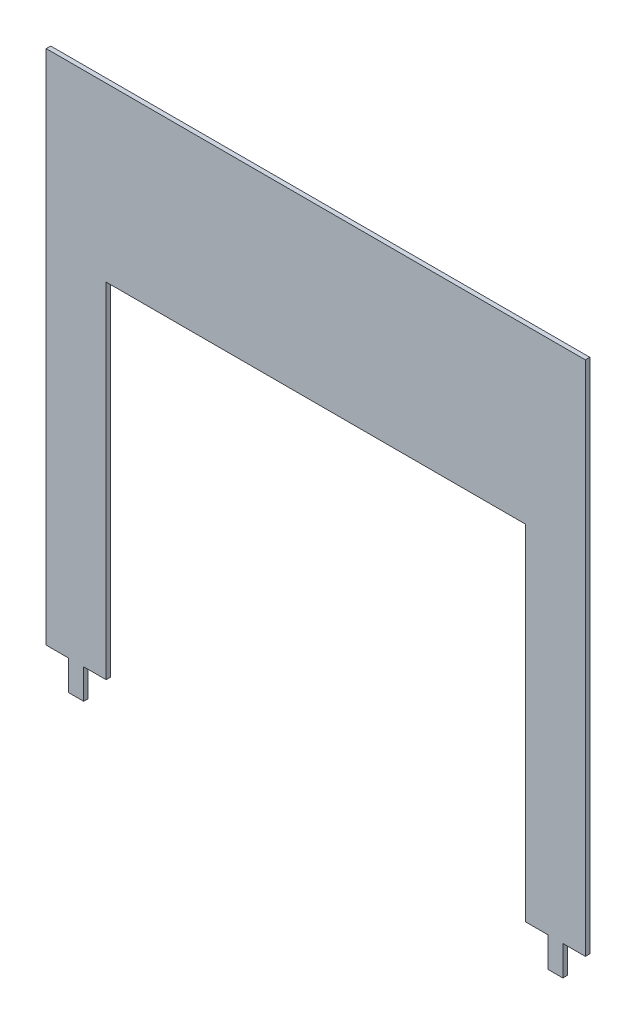
ISO-10303-21;
HEADER;
FILE_DESCRIPTION(('STEP AP214'),'2;1');
FILE_NAME('part.step','',(''),(''),'','','');
FILE_SCHEMA(('AUTOMOTIVE_DESIGN { 1 0 10303 214 1 1 1 1 }'));
ENDSEC;
DATA;
#1=APPLICATION_CONTEXT('core data for automotive mechanical design processes');
#2=APPLICATION_PROTOCOL_DEFINITION('international standard','automotive_design',2000,#1);
#3=PRODUCT_CONTEXT('',#1,'mechanical');
#4=PRODUCT('Part','Part','',(#3));
#5=PRODUCT_RELATED_PRODUCT_CATEGORY('part','',(#4));
#6=PRODUCT_DEFINITION_FORMATION('','',#4);
#7=PRODUCT_DEFINITION_CONTEXT('part definition',#1,'design');
#8=PRODUCT_DEFINITION('design','',#6,#7);
#9=PRODUCT_DEFINITION_SHAPE('','',#8);
#10=(LENGTH_UNIT() NAMED_UNIT(*) SI_UNIT(.MILLI.,.METRE.));
#11=(NAMED_UNIT(*) PLANE_ANGLE_UNIT() SI_UNIT($,.RADIAN.));
#12=(NAMED_UNIT(*) SI_UNIT($,.STERADIAN.) SOLID_ANGLE_UNIT());
#13=UNCERTAINTY_MEASURE_WITH_UNIT(LENGTH_MEASURE(1.E-05),#10,'distance_accuracy_value','');
#14=(GEOMETRIC_REPRESENTATION_CONTEXT(3) GLOBAL_UNCERTAINTY_ASSIGNED_CONTEXT((#13)) GLOBAL_UNIT_ASSIGNED_CONTEXT((#10,
#11,#12)) REPRESENTATION_CONTEXT('',''));
#15=CARTESIAN_POINT('',(0.,0.,0.));
#16=DIRECTION('',(0.,0.,1.));
#17=DIRECTION('',(1.,0.,0.));
#18=AXIS2_PLACEMENT_3D('',#15,#16,#17);
#19=CARTESIAN_POINT('',(0.,0.,0.3));
#20=DIRECTION('',(0.,0.,1.));
#21=DIRECTION('',(1.,0.,0.));
#22=AXIS2_PLACEMENT_3D('',#19,#20,#21);
#23=PLANE('',#22);
#24=DIRECTION('',(1.,0.,0.));
#25=VECTOR('',#24,1.);
#26=CARTESIAN_POINT('',(18.,34.5,0.3));
#27=LINE('',#26,#25);
#28=CARTESIAN_POINT('',(-18.,34.5,0.3));
#29=VERTEX_POINT('',#28);
#30=CARTESIAN_POINT('',(18.,34.5,0.3));
#31=VERTEX_POINT('',#30);
#32=EDGE_CURVE('E86',#29,#31,#27,.T.);
#33=ORIENTED_EDGE('',*,*,#32,.F.);
#34=DIRECTION('',(0.,1.,0.));
#35=VECTOR('',#34,1.);
#36=CARTESIAN_POINT('',(-18.,34.5,0.3));
#37=LINE('',#36,#35);
#38=CARTESIAN_POINT('',(-18.,0.,0.3));
#39=VERTEX_POINT('',#38);
#40=EDGE_CURVE('E143',#39,#29,#37,.T.);
#41=ORIENTED_EDGE('',*,*,#40,.F.);
#42=DIRECTION('',(1.,0.,0.));
#43=VECTOR('',#42,1.);
#44=CARTESIAN_POINT('',(-18.,0.,0.3));
#45=LINE('',#44,#43);
#46=CARTESIAN_POINT('',(-16.5,0.,0.3));
#47=VERTEX_POINT('',#46);
#48=EDGE_CURVE('E134',#47,#39,#45,.F.);
#49=ORIENTED_EDGE('',*,*,#48,.F.);
#50=DIRECTION('',(0.,1.,0.));
#51=VECTOR('',#50,1.);
#52=CARTESIAN_POINT('',(-16.5,0.,0.3));
#53=LINE('',#52,#51);
#54=CARTESIAN_POINT('',(-16.5,-2.,0.3));
#55=VERTEX_POINT('',#54);
#56=EDGE_CURVE('E148',#55,#47,#53,.T.);
#57=ORIENTED_EDGE('',*,*,#56,.F.);
#58=DIRECTION('',(1.,0.,0.));
#59=VECTOR('',#58,1.);
#60=CARTESIAN_POINT('',(-16.5,-2.,0.3));
#61=LINE('',#60,#59);
#62=CARTESIAN_POINT('',(-15.5,-2.,0.3));
#63=VERTEX_POINT('',#62);
#64=EDGE_CURVE('E152',#63,#55,#61,.F.);
#65=ORIENTED_EDGE('',*,*,#64,.F.);
#66=DIRECTION('',(0.,1.,0.));
#67=VECTOR('',#66,1.);
#68=CARTESIAN_POINT('',(-15.5,-2.,0.3));
#69=LINE('',#68,#67);
#70=CARTESIAN_POINT('',(-15.5,0.,0.3));
#71=VERTEX_POINT('',#70);
#72=EDGE_CURVE('E156',#71,#63,#69,.F.);
#73=ORIENTED_EDGE('',*,*,#72,.F.);
#74=DIRECTION('',(1.,0.,0.));
#75=VECTOR('',#74,1.);
#76=CARTESIAN_POINT('',(-15.5,0.,0.3));
#77=LINE('',#76,#75);
#78=CARTESIAN_POINT('',(-14.,0.,0.3));
#79=VERTEX_POINT('',#78);
#80=EDGE_CURVE('E160',#79,#71,#77,.F.);
#81=ORIENTED_EDGE('',*,*,#80,.F.);
#82=DIRECTION('',(0.,1.,0.));
#83=VECTOR('',#82,1.);
#84=CARTESIAN_POINT('',(-14.,0.,0.3));
#85=LINE('',#84,#83);
#86=CARTESIAN_POINT('',(-14.,23.,0.3));
#87=VERTEX_POINT('',#86);
#88=EDGE_CURVE('E164',#87,#79,#85,.F.);
#89=ORIENTED_EDGE('',*,*,#88,.F.);
#90=DIRECTION('',(1.,0.,0.));
#91=VECTOR('',#90,1.);
#92=CARTESIAN_POINT('',(-14.,23.,0.3));
#93=LINE('',#92,#91);
#94=CARTESIAN_POINT('',(14.,23.,0.3));
#95=VERTEX_POINT('',#94);
#96=EDGE_CURVE('E168',#95,#87,#93,.F.);
#97=ORIENTED_EDGE('',*,*,#96,.F.);
#98=DIRECTION('',(0.,1.,0.));
#99=VECTOR('',#98,1.);
#100=CARTESIAN_POINT('',(14.,23.,0.3));
#101=LINE('',#100,#99);
#102=CARTESIAN_POINT('',(14.,0.,0.3));
#103=VERTEX_POINT('',#102);
#104=EDGE_CURVE('E172',#103,#95,#101,.T.);
#105=ORIENTED_EDGE('',*,*,#104,.F.);
#106=DIRECTION('',(1.,0.,0.));
#107=VECTOR('',#106,1.);
#108=CARTESIAN_POINT('',(14.,0.,0.3));
#109=LINE('',#108,#107);
#110=CARTESIAN_POINT('',(15.5,0.,0.3));
#111=VERTEX_POINT('',#110);
#112=EDGE_CURVE('E176',#111,#103,#109,.F.);
#113=ORIENTED_EDGE('',*,*,#112,.F.);
#114=DIRECTION('',(0.,1.,0.));
#115=VECTOR('',#114,1.);
#116=CARTESIAN_POINT('',(15.5,0.,0.3));
#117=LINE('',#116,#115);
#118=CARTESIAN_POINT('',(15.5,-2.,0.3));
#119=VERTEX_POINT('',#118);
#120=EDGE_CURVE('E180',#119,#111,#117,.T.);
#121=ORIENTED_EDGE('',*,*,#120,.F.);
#122=DIRECTION('',(1.,0.,0.));
#123=VECTOR('',#122,1.);
#124=CARTESIAN_POINT('',(15.5,-2.,0.3));
#125=LINE('',#124,#123);
#126=CARTESIAN_POINT('',(16.5,-2.,0.3));
#127=VERTEX_POINT('',#126);
#128=EDGE_CURVE('E184',#127,#119,#125,.F.);
#129=ORIENTED_EDGE('',*,*,#128,.F.);
#130=DIRECTION('',(0.,1.,0.));
#131=VECTOR('',#130,1.);
#132=CARTESIAN_POINT('',(16.5,-2.,0.3));
#133=LINE('',#132,#131);
#134=CARTESIAN_POINT('',(16.5,0.,0.3));
#135=VERTEX_POINT('',#134);
#136=EDGE_CURVE('E188',#135,#127,#133,.F.);
#137=ORIENTED_EDGE('',*,*,#136,.F.);
#138=DIRECTION('',(1.,0.,0.));
#139=VECTOR('',#138,1.);
#140=CARTESIAN_POINT('',(16.5,0.,0.3));
#141=LINE('',#140,#139);
#142=CARTESIAN_POINT('',(18.,0.,0.3));
#143=VERTEX_POINT('',#142);
#144=EDGE_CURVE('E192',#143,#135,#141,.F.);
#145=ORIENTED_EDGE('',*,*,#144,.F.);
#146=DIRECTION('',(0.,1.,0.));
#147=VECTOR('',#146,1.);
#148=CARTESIAN_POINT('',(18.,0.,0.3));
#149=LINE('',#148,#147);
#150=EDGE_CURVE('E196',#31,#143,#149,.F.);
#151=ORIENTED_EDGE('',*,*,#150,.F.);
#152=EDGE_LOOP('',(#33,#41,#49,#57,#65,#73,#81,#89,#97,#105,#113,#121,#129,#137,#145,#151));
#153=FACE_BOUND('',#152,.T.);
#154=ADVANCED_FACE('F15',(#153),#23,.T.);
#155=CARTESIAN_POINT('',(-18.,34.5,0.));
#156=DIRECTION('',(-1.,0.,0.));
#157=DIRECTION('',(0.,0.,1.));
#158=AXIS2_PLACEMENT_3D('',#155,#156,#157);
#159=PLANE('',#158);
#160=DIRECTION('',(0.,0.,1.));
#161=VECTOR('',#160,1.);
#162=CARTESIAN_POINT('',(-18.,34.5,0.));
#163=LINE('',#162,#161);
#164=CARTESIAN_POINT('',(-18.,34.5,0.));
#165=VERTEX_POINT('',#164);
#166=EDGE_CURVE('E200',#165,#29,#163,.T.);
#167=ORIENTED_EDGE('',*,*,#166,.F.);
#168=DIRECTION('',(0.,1.,0.));
#169=VECTOR('',#168,1.);
#170=CARTESIAN_POINT('',(-18.,0.,0.));
#171=LINE('',#170,#169);
#172=CARTESIAN_POINT('',(-18.,0.,0.));
#173=VERTEX_POINT('',#172);
#174=EDGE_CURVE('E19',#165,#173,#171,.F.);
#175=ORIENTED_EDGE('',*,*,#174,.T.);
#176=DIRECTION('',(0.,0.,-1.));
#177=VECTOR('',#176,1.);
#178=CARTESIAN_POINT('',(-18.,0.,0.));
#179=LINE('',#178,#177);
#180=EDGE_CURVE('E139',#39,#173,#179,.T.);
#181=ORIENTED_EDGE('',*,*,#180,.F.);
#182=ORIENTED_EDGE('',*,*,#40,.T.);
#183=EDGE_LOOP('',(#167,#175,#181,#182));
#184=FACE_BOUND('',#183,.T.);
#185=ADVANCED_FACE('F147',(#184),#159,.T.);
#186=CARTESIAN_POINT('',(-18.,0.,0.));
#187=DIRECTION('',(0.,-1.,0.));
#188=DIRECTION('',(0.,0.,-1.));
#189=AXIS2_PLACEMENT_3D('',#186,#187,#188);
#190=PLANE('',#189);
#191=ORIENTED_EDGE('',*,*,#180,.T.);
#192=DIRECTION('',(1.,0.,0.));
#193=VECTOR('',#192,1.);
#194=CARTESIAN_POINT('',(0.,0.,0.));
#195=LINE('',#194,#193);
#196=CARTESIAN_POINT('',(-16.5,0.,0.));
#197=VERTEX_POINT('',#196);
#198=EDGE_CURVE('E242',#173,#197,#195,.T.);
#199=ORIENTED_EDGE('',*,*,#198,.T.);
#200=DIRECTION('',(0.,0.,1.));
#201=VECTOR('',#200,1.);
#202=CARTESIAN_POINT('',(-16.5,0.,0.));
#203=LINE('',#202,#201);
#204=EDGE_CURVE('E140',#47,#197,#203,.F.);
#205=ORIENTED_EDGE('',*,*,#204,.F.);
#206=ORIENTED_EDGE('',*,*,#48,.T.);
#207=EDGE_LOOP('',(#191,#199,#205,#206));
#208=FACE_BOUND('',#207,.T.);
#209=ADVANCED_FACE('F136',(#208),#190,.T.);
#210=CARTESIAN_POINT('',(-16.5,0.,0.));
#211=DIRECTION('',(-1.,0.,0.));
#212=DIRECTION('',(0.,0.,1.));
#213=AXIS2_PLACEMENT_3D('',#210,#211,#212);
#214=PLANE('',#213);
#215=ORIENTED_EDGE('',*,*,#204,.T.);
#216=DIRECTION('',(0.,1.,0.));
#217=VECTOR('',#216,1.);
#218=CARTESIAN_POINT('',(-16.5,0.,0.));
#219=LINE('',#218,#217);
#220=CARTESIAN_POINT('',(-16.5,-2.,0.));
#221=VERTEX_POINT('',#220);
#222=EDGE_CURVE('E240',#197,#221,#219,.F.);
#223=ORIENTED_EDGE('',*,*,#222,.T.);
#224=DIRECTION('',(0.,0.,-1.));
#225=VECTOR('',#224,1.);
#226=CARTESIAN_POINT('',(-16.5,-2.,0.));
#227=LINE('',#226,#225);
#228=EDGE_CURVE('E154',#55,#221,#227,.T.);
#229=ORIENTED_EDGE('',*,*,#228,.F.);
#230=ORIENTED_EDGE('',*,*,#56,.T.);
#231=EDGE_LOOP('',(#215,#223,#229,#230));
#232=FACE_BOUND('',#231,.T.);
#233=ADVANCED_FACE('F249',(#232),#214,.T.);
#234=CARTESIAN_POINT('',(-16.5,-2.,0.));
#235=DIRECTION('',(0.,-1.,0.));
#236=DIRECTION('',(0.,0.,-1.));
#237=AXIS2_PLACEMENT_3D('',#234,#235,#236);
#238=PLANE('',#237);
#239=ORIENTED_EDGE('',*,*,#228,.T.);
#240=DIRECTION('',(1.,0.,0.));
#241=VECTOR('',#240,1.);
#242=CARTESIAN_POINT('',(0.,-2.,0.));
#243=LINE('',#242,#241);
#244=CARTESIAN_POINT('',(-15.5,-2.,0.));
#245=VERTEX_POINT('',#244);
#246=EDGE_CURVE('E237',#221,#245,#243,.T.);
#247=ORIENTED_EDGE('',*,*,#246,.T.);
#248=DIRECTION('',(0.,0.,-1.));
#249=VECTOR('',#248,1.);
#250=CARTESIAN_POINT('',(-15.5,-2.,0.));
#251=LINE('',#250,#249);
#252=EDGE_CURVE('E158',#63,#245,#251,.T.);
#253=ORIENTED_EDGE('',*,*,#252,.F.);
#254=ORIENTED_EDGE('',*,*,#64,.T.);
#255=EDGE_LOOP('',(#239,#247,#253,#254));
#256=FACE_BOUND('',#255,.T.);
#257=ADVANCED_FACE('F256',(#256),#238,.T.);
#258=CARTESIAN_POINT('',(-15.5,-2.,0.));
#259=DIRECTION('',(1.,0.,0.));
#260=DIRECTION('',(0.,0.,-1.));
#261=AXIS2_PLACEMENT_3D('',#258,#259,#260);
#262=PLANE('',#261);
#263=ORIENTED_EDGE('',*,*,#252,.T.);
#264=DIRECTION('',(0.,1.,0.));
#265=VECTOR('',#264,1.);
#266=CARTESIAN_POINT('',(-15.5,0.,0.));
#267=LINE('',#266,#265);
#268=CARTESIAN_POINT('',(-15.5,0.,0.));
#269=VERTEX_POINT('',#268);
#270=EDGE_CURVE('E234',#245,#269,#267,.T.);
#271=ORIENTED_EDGE('',*,*,#270,.T.);
#272=DIRECTION('',(0.,0.,-1.));
#273=VECTOR('',#272,1.);
#274=CARTESIAN_POINT('',(-15.5,0.,0.));
#275=LINE('',#274,#273);
#276=EDGE_CURVE('E162',#71,#269,#275,.T.);
#277=ORIENTED_EDGE('',*,*,#276,.F.);
#278=ORIENTED_EDGE('',*,*,#72,.T.);
#279=EDGE_LOOP('',(#263,#271,#277,#278));
#280=FACE_BOUND('',#279,.T.);
#281=ADVANCED_FACE('F258',(#280),#262,.T.);
#282=CARTESIAN_POINT('',(-15.5,0.,0.));
#283=DIRECTION('',(0.,-1.,0.));
#284=DIRECTION('',(0.,0.,-1.));
#285=AXIS2_PLACEMENT_3D('',#282,#283,#284);
#286=PLANE('',#285);
#287=ORIENTED_EDGE('',*,*,#276,.T.);
#288=DIRECTION('',(1.,0.,0.));
#289=VECTOR('',#288,1.);
#290=CARTESIAN_POINT('',(0.,0.,0.));
#291=LINE('',#290,#289);
#292=CARTESIAN_POINT('',(-14.,0.,0.));
#293=VERTEX_POINT('',#292);
#294=EDGE_CURVE('E231',#269,#293,#291,.T.);
#295=ORIENTED_EDGE('',*,*,#294,.T.);
#296=DIRECTION('',(0.,0.,-1.));
#297=VECTOR('',#296,1.);
#298=CARTESIAN_POINT('',(-14.,0.,0.));
#299=LINE('',#298,#297);
#300=EDGE_CURVE('E166',#79,#293,#299,.T.);
#301=ORIENTED_EDGE('',*,*,#300,.F.);
#302=ORIENTED_EDGE('',*,*,#80,.T.);
#303=EDGE_LOOP('',(#287,#295,#301,#302));
#304=FACE_BOUND('',#303,.T.);
#305=ADVANCED_FACE('F264',(#304),#286,.T.);
#306=CARTESIAN_POINT('',(-14.,0.,0.));
#307=DIRECTION('',(1.,0.,0.));
#308=DIRECTION('',(0.,0.,-1.));
#309=AXIS2_PLACEMENT_3D('',#306,#307,#308);
#310=PLANE('',#309);
#311=ORIENTED_EDGE('',*,*,#300,.T.);
#312=DIRECTION('',(0.,1.,0.));
#313=VECTOR('',#312,1.);
#314=CARTESIAN_POINT('',(-14.,0.,0.));
#315=LINE('',#314,#313);
#316=CARTESIAN_POINT('',(-14.,23.,0.));
#317=VERTEX_POINT('',#316);
#318=EDGE_CURVE('E228',#293,#317,#315,.T.);
#319=ORIENTED_EDGE('',*,*,#318,.T.);
#320=DIRECTION('',(0.,0.,-1.));
#321=VECTOR('',#320,1.);
#322=CARTESIAN_POINT('',(-14.,23.,0.));
#323=LINE('',#322,#321);
#324=EDGE_CURVE('E170',#87,#317,#323,.T.);
#325=ORIENTED_EDGE('',*,*,#324,.F.);
#326=ORIENTED_EDGE('',*,*,#88,.T.);
#327=EDGE_LOOP('',(#311,#319,#325,#326));
#328=FACE_BOUND('',#327,.T.);
#329=ADVANCED_FACE('F271',(#328),#310,.T.);
#330=CARTESIAN_POINT('',(-14.,23.,0.));
#331=DIRECTION('',(0.,-1.,0.));
#332=DIRECTION('',(0.,0.,-1.));
#333=AXIS2_PLACEMENT_3D('',#330,#331,#332);
#334=PLANE('',#333);
#335=ORIENTED_EDGE('',*,*,#324,.T.);
#336=DIRECTION('',(1.,0.,0.));
#337=VECTOR('',#336,1.);
#338=CARTESIAN_POINT('',(0.,23.,0.));
#339=LINE('',#338,#337);
#340=CARTESIAN_POINT('',(14.,23.,0.));
#341=VERTEX_POINT('',#340);
#342=EDGE_CURVE('E225',#317,#341,#339,.T.);
#343=ORIENTED_EDGE('',*,*,#342,.T.);
#344=DIRECTION('',(0.,0.,1.));
#345=VECTOR('',#344,1.);
#346=CARTESIAN_POINT('',(14.,23.,0.));
#347=LINE('',#346,#345);
#348=EDGE_CURVE('E174',#95,#341,#347,.F.);
#349=ORIENTED_EDGE('',*,*,#348,.F.);
#350=ORIENTED_EDGE('',*,*,#96,.T.);
#351=EDGE_LOOP('',(#335,#343,#349,#350));
#352=FACE_BOUND('',#351,.T.);
#353=ADVANCED_FACE('F273',(#352),#334,.T.);
#354=CARTESIAN_POINT('',(14.,23.,0.));
#355=DIRECTION('',(-1.,0.,0.));
#356=DIRECTION('',(0.,0.,1.));
#357=AXIS2_PLACEMENT_3D('',#354,#355,#356);
#358=PLANE('',#357);
#359=ORIENTED_EDGE('',*,*,#348,.T.);
#360=DIRECTION('',(0.,1.,0.));
#361=VECTOR('',#360,1.);
#362=CARTESIAN_POINT('',(14.,0.,0.));
#363=LINE('',#362,#361);
#364=CARTESIAN_POINT('',(14.,0.,0.));
#365=VERTEX_POINT('',#364);
#366=EDGE_CURVE('E222',#341,#365,#363,.F.);
#367=ORIENTED_EDGE('',*,*,#366,.T.);
#368=DIRECTION('',(0.,0.,-1.));
#369=VECTOR('',#368,1.);
#370=CARTESIAN_POINT('',(14.,0.,0.));
#371=LINE('',#370,#369);
#372=EDGE_CURVE('E178',#103,#365,#371,.T.);
#373=ORIENTED_EDGE('',*,*,#372,.F.);
#374=ORIENTED_EDGE('',*,*,#104,.T.);
#375=EDGE_LOOP('',(#359,#367,#373,#374));
#376=FACE_BOUND('',#375,.T.);
#377=ADVANCED_FACE('F279',(#376),#358,.T.);
#378=CARTESIAN_POINT('',(14.,0.,0.));
#379=DIRECTION('',(0.,-1.,0.));
#380=DIRECTION('',(0.,0.,-1.));
#381=AXIS2_PLACEMENT_3D('',#378,#379,#380);
#382=PLANE('',#381);
#383=ORIENTED_EDGE('',*,*,#372,.T.);
#384=DIRECTION('',(1.,0.,0.));
#385=VECTOR('',#384,1.);
#386=CARTESIAN_POINT('',(0.,0.,0.));
#387=LINE('',#386,#385);
#388=CARTESIAN_POINT('',(15.5,0.,0.));
#389=VERTEX_POINT('',#388);
#390=EDGE_CURVE('E219',#365,#389,#387,.T.);
#391=ORIENTED_EDGE('',*,*,#390,.T.);
#392=DIRECTION('',(0.,0.,1.));
#393=VECTOR('',#392,1.);
#394=CARTESIAN_POINT('',(15.5,0.,0.));
#395=LINE('',#394,#393);
#396=EDGE_CURVE('E182',#111,#389,#395,.F.);
#397=ORIENTED_EDGE('',*,*,#396,.F.);
#398=ORIENTED_EDGE('',*,*,#112,.T.);
#399=EDGE_LOOP('',(#383,#391,#397,#398));
#400=FACE_BOUND('',#399,.T.);
#401=ADVANCED_FACE('F286',(#400),#382,.T.);
#402=CARTESIAN_POINT('',(15.5,0.,0.));
#403=DIRECTION('',(-1.,0.,0.));
#404=DIRECTION('',(0.,0.,1.));
#405=AXIS2_PLACEMENT_3D('',#402,#403,#404);
#406=PLANE('',#405);
#407=ORIENTED_EDGE('',*,*,#396,.T.);
#408=DIRECTION('',(0.,1.,0.));
#409=VECTOR('',#408,1.);
#410=CARTESIAN_POINT('',(15.5,0.,0.));
#411=LINE('',#410,#409);
#412=CARTESIAN_POINT('',(15.5,-2.,0.));
#413=VERTEX_POINT('',#412);
#414=EDGE_CURVE('E216',#389,#413,#411,.F.);
#415=ORIENTED_EDGE('',*,*,#414,.T.);
#416=DIRECTION('',(0.,0.,-1.));
#417=VECTOR('',#416,1.);
#418=CARTESIAN_POINT('',(15.5,-2.,0.));
#419=LINE('',#418,#417);
#420=EDGE_CURVE('E186',#119,#413,#419,.T.);
#421=ORIENTED_EDGE('',*,*,#420,.F.);
#422=ORIENTED_EDGE('',*,*,#120,.T.);
#423=EDGE_LOOP('',(#407,#415,#421,#422));
#424=FACE_BOUND('',#423,.T.);
#425=ADVANCED_FACE('F288',(#424),#406,.T.);
#426=CARTESIAN_POINT('',(15.5,-2.,0.));
#427=DIRECTION('',(0.,-1.,0.));
#428=DIRECTION('',(0.,0.,-1.));
#429=AXIS2_PLACEMENT_3D('',#426,#427,#428);
#430=PLANE('',#429);
#431=ORIENTED_EDGE('',*,*,#420,.T.);
#432=DIRECTION('',(1.,0.,0.));
#433=VECTOR('',#432,1.);
#434=CARTESIAN_POINT('',(0.,-2.,0.));
#435=LINE('',#434,#433);
#436=CARTESIAN_POINT('',(16.5,-2.,0.));
#437=VERTEX_POINT('',#436);
#438=EDGE_CURVE('E213',#413,#437,#435,.T.);
#439=ORIENTED_EDGE('',*,*,#438,.T.);
#440=DIRECTION('',(0.,0.,-1.));
#441=VECTOR('',#440,1.);
#442=CARTESIAN_POINT('',(16.5,-2.,0.));
#443=LINE('',#442,#441);
#444=EDGE_CURVE('E190',#127,#437,#443,.T.);
#445=ORIENTED_EDGE('',*,*,#444,.F.);
#446=ORIENTED_EDGE('',*,*,#128,.T.);
#447=EDGE_LOOP('',(#431,#439,#445,#446));
#448=FACE_BOUND('',#447,.T.);
#449=ADVANCED_FACE('F294',(#448),#430,.T.);
#450=CARTESIAN_POINT('',(16.5,-2.,0.));
#451=DIRECTION('',(1.,0.,0.));
#452=DIRECTION('',(0.,0.,-1.));
#453=AXIS2_PLACEMENT_3D('',#450,#451,#452);
#454=PLANE('',#453);
#455=ORIENTED_EDGE('',*,*,#444,.T.);
#456=DIRECTION('',(0.,1.,0.));
#457=VECTOR('',#456,1.);
#458=CARTESIAN_POINT('',(16.5,0.,0.));
#459=LINE('',#458,#457);
#460=CARTESIAN_POINT('',(16.5,0.,0.));
#461=VERTEX_POINT('',#460);
#462=EDGE_CURVE('E210',#437,#461,#459,.T.);
#463=ORIENTED_EDGE('',*,*,#462,.T.);
#464=DIRECTION('',(0.,0.,-1.));
#465=VECTOR('',#464,1.);
#466=CARTESIAN_POINT('',(16.5,0.,0.));
#467=LINE('',#466,#465);
#468=EDGE_CURVE('E194',#135,#461,#467,.T.);
#469=ORIENTED_EDGE('',*,*,#468,.F.);
#470=ORIENTED_EDGE('',*,*,#136,.T.);
#471=EDGE_LOOP('',(#455,#463,#469,#470));
#472=FACE_BOUND('',#471,.T.);
#473=ADVANCED_FACE('F300',(#472),#454,.T.);
#474=CARTESIAN_POINT('',(16.5,0.,0.));
#475=DIRECTION('',(0.,-1.,0.));
#476=DIRECTION('',(0.,0.,-1.));
#477=AXIS2_PLACEMENT_3D('',#474,#475,#476);
#478=PLANE('',#477);
#479=ORIENTED_EDGE('',*,*,#468,.T.);
#480=DIRECTION('',(1.,0.,0.));
#481=VECTOR('',#480,1.);
#482=CARTESIAN_POINT('',(0.,0.,0.));
#483=LINE('',#482,#481);
#484=CARTESIAN_POINT('',(18.,0.,0.));
#485=VERTEX_POINT('',#484);
#486=EDGE_CURVE('E207',#461,#485,#483,.T.);
#487=ORIENTED_EDGE('',*,*,#486,.T.);
#488=DIRECTION('',(0.,0.,-1.));
#489=VECTOR('',#488,1.);
#490=CARTESIAN_POINT('',(18.,0.,0.));
#491=LINE('',#490,#489);
#492=EDGE_CURVE('E198',#143,#485,#491,.T.);
#493=ORIENTED_EDGE('',*,*,#492,.F.);
#494=ORIENTED_EDGE('',*,*,#144,.T.);
#495=EDGE_LOOP('',(#479,#487,#493,#494));
#496=FACE_BOUND('',#495,.T.);
#497=ADVANCED_FACE('F302',(#496),#478,.T.);
#498=CARTESIAN_POINT('',(18.,0.,0.));
#499=DIRECTION('',(1.,0.,0.));
#500=DIRECTION('',(0.,0.,-1.));
#501=AXIS2_PLACEMENT_3D('',#498,#499,#500);
#502=PLANE('',#501);
#503=ORIENTED_EDGE('',*,*,#492,.T.);
#504=DIRECTION('',(0.,1.,0.));
#505=VECTOR('',#504,1.);
#506=CARTESIAN_POINT('',(18.,0.,0.));
#507=LINE('',#506,#505);
#508=CARTESIAN_POINT('',(18.,34.5,0.));
#509=VERTEX_POINT('',#508);
#510=EDGE_CURVE('E25',#485,#509,#507,.T.);
#511=ORIENTED_EDGE('',*,*,#510,.T.);
#512=DIRECTION('',(0.,0.,1.));
#513=VECTOR('',#512,1.);
#514=CARTESIAN_POINT('',(18.,34.5,0.));
#515=LINE('',#514,#513);
#516=EDGE_CURVE('E33',#31,#509,#515,.F.);
#517=ORIENTED_EDGE('',*,*,#516,.F.);
#518=ORIENTED_EDGE('',*,*,#150,.T.);
#519=EDGE_LOOP('',(#503,#511,#517,#518));
#520=FACE_BOUND('',#519,.T.);
#521=ADVANCED_FACE('F304',(#520),#502,.T.);
#522=CARTESIAN_POINT('',(18.,34.5,0.));
#523=DIRECTION('',(0.,1.,0.));
#524=DIRECTION('',(0.,0.,1.));
#525=AXIS2_PLACEMENT_3D('',#522,#523,#524);
#526=PLANE('',#525);
#527=ORIENTED_EDGE('',*,*,#516,.T.);
#528=DIRECTION('',(1.,0.,0.));
#529=VECTOR('',#528,1.);
#530=CARTESIAN_POINT('',(0.,34.5,0.));
#531=LINE('',#530,#529);
#532=EDGE_CURVE('E10',#509,#165,#531,.F.);
#533=ORIENTED_EDGE('',*,*,#532,.T.);
#534=ORIENTED_EDGE('',*,*,#166,.T.);
#535=ORIENTED_EDGE('',*,*,#32,.T.);
#536=EDGE_LOOP('',(#527,#533,#534,#535));
#537=FACE_BOUND('',#536,.T.);
#538=ADVANCED_FACE('F306',(#537),#526,.T.);
#539=CARTESIAN_POINT('',(0.,0.,0.));
#540=DIRECTION('',(0.,0.,1.));
#541=DIRECTION('',(1.,0.,0.));
#542=AXIS2_PLACEMENT_3D('',#539,#540,#541);
#543=PLANE('',#542);
#544=ORIENTED_EDGE('',*,*,#510,.F.);
#545=ORIENTED_EDGE('',*,*,#486,.F.);
#546=ORIENTED_EDGE('',*,*,#462,.F.);
#547=ORIENTED_EDGE('',*,*,#438,.F.);
#548=ORIENTED_EDGE('',*,*,#414,.F.);
#549=ORIENTED_EDGE('',*,*,#390,.F.);
#550=ORIENTED_EDGE('',*,*,#366,.F.);
#551=ORIENTED_EDGE('',*,*,#342,.F.);
#552=ORIENTED_EDGE('',*,*,#318,.F.);
#553=ORIENTED_EDGE('',*,*,#294,.F.);
#554=ORIENTED_EDGE('',*,*,#270,.F.);
#555=ORIENTED_EDGE('',*,*,#246,.F.);
#556=ORIENTED_EDGE('',*,*,#222,.F.);
#557=ORIENTED_EDGE('',*,*,#198,.F.);
#558=ORIENTED_EDGE('',*,*,#174,.F.);
#559=ORIENTED_EDGE('',*,*,#532,.F.);
#560=EDGE_LOOP('',(#544,#545,#546,#547,#548,#549,#550,#551,#552,#553,#554,#555,#556,#557,#558,#559));
#561=FACE_BOUND('',#560,.T.);
#562=ADVANCED_FACE('F17',(#561),#543,.F.);
#563=CLOSED_SHELL('',(#154,#185,#209,#233,#257,#281,#305,#329,#353,#377,#401,#425,#449,#473,
#497,#521,#538,#562));
#564=MANIFOLD_SOLID_BREP('B1',#563);
#565=ADVANCED_BREP_SHAPE_REPRESENTATION('',(#18,#564),#14);
#566=SHAPE_DEFINITION_REPRESENTATION(#9,#565);
ENDSEC;
END-ISO-10303-21;
